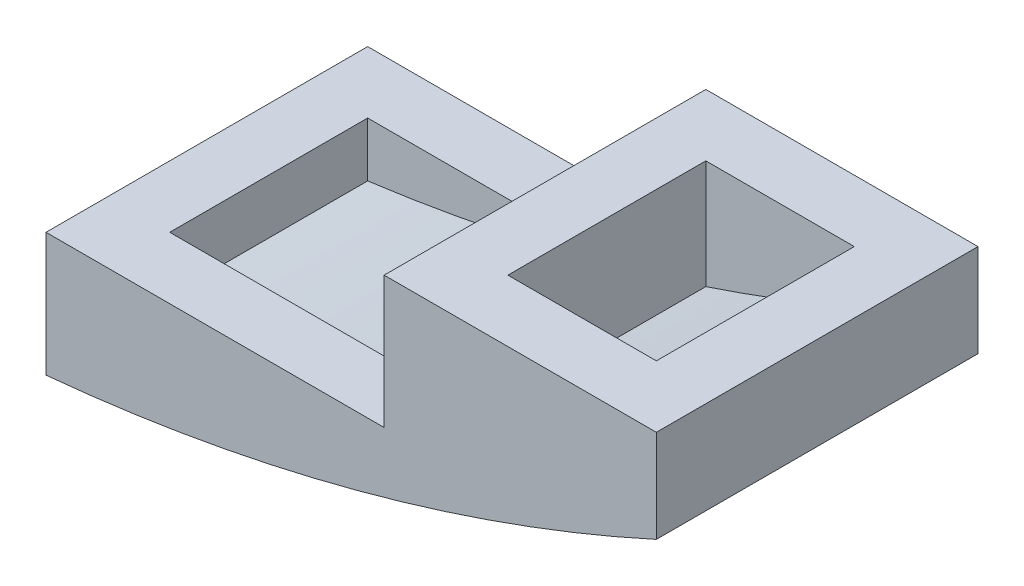
ISO-10303-21;
HEADER;
FILE_DESCRIPTION(('STEP AP214'),'2;1');
FILE_NAME('part.step','',(''),(''),'','','');
FILE_SCHEMA(('AUTOMOTIVE_DESIGN { 1 0 10303 214 1 1 1 1 }'));
ENDSEC;
DATA;
#1=APPLICATION_CONTEXT('core data for automotive mechanical design processes');
#2=APPLICATION_PROTOCOL_DEFINITION('international standard','automotive_design',2000,#1);
#3=PRODUCT_CONTEXT('',#1,'mechanical');
#4=PRODUCT('Part','Part','',(#3));
#5=PRODUCT_RELATED_PRODUCT_CATEGORY('part','',(#4));
#6=PRODUCT_DEFINITION_FORMATION('','',#4);
#7=PRODUCT_DEFINITION_CONTEXT('part definition',#1,'design');
#8=PRODUCT_DEFINITION('design','',#6,#7);
#9=PRODUCT_DEFINITION_SHAPE('','',#8);
#10=(LENGTH_UNIT() NAMED_UNIT(*) SI_UNIT(.MILLI.,.METRE.));
#11=(NAMED_UNIT(*) PLANE_ANGLE_UNIT() SI_UNIT($,.RADIAN.));
#12=(NAMED_UNIT(*) SI_UNIT($,.STERADIAN.) SOLID_ANGLE_UNIT());
#13=UNCERTAINTY_MEASURE_WITH_UNIT(LENGTH_MEASURE(1.E-05),#10,'distance_accuracy_value','');
#14=(GEOMETRIC_REPRESENTATION_CONTEXT(3) GLOBAL_UNCERTAINTY_ASSIGNED_CONTEXT((#13)) GLOBAL_UNIT_ASSIGNED_CONTEXT((#10,
#11,#12)) REPRESENTATION_CONTEXT('',''));
#15=CARTESIAN_POINT('',(0.,0.,0.));
#16=DIRECTION('',(0.,0.,1.));
#17=DIRECTION('',(1.,0.,0.));
#18=AXIS2_PLACEMENT_3D('',#15,#16,#17);
#19=CARTESIAN_POINT('',(12.5302756443327,-42.9264125407907,-7.8));
#20=DIRECTION('',(0.,1.,0.));
#21=DIRECTION('',(0.,0.,1.));
#22=AXIS2_PLACEMENT_3D('',#19,#20,#21);
#23=PLANE('',#22);
#24=DIRECTION('',(-1.,0.,0.));
#25=VECTOR('',#24,1.);
#26=CARTESIAN_POINT('',(12.5302756443327,-42.9264125407907,0.));
#27=LINE('',#26,#25);
#28=CARTESIAN_POINT('',(12.5302756443327,-42.9264125407907,0.));
#29=VERTEX_POINT('',#28);
#30=CARTESIAN_POINT('',(4.33027564433265,-42.9264125407907,0.));
#31=VERTEX_POINT('',#30);
#32=EDGE_CURVE('E217',#29,#31,#27,.T.);
#33=ORIENTED_EDGE('',*,*,#32,.F.);
#34=DIRECTION('',(0.,0.,1.));
#35=VECTOR('',#34,1.);
#36=CARTESIAN_POINT('',(12.5302756443327,-42.9264125407907,-7.8));
#37=LINE('',#36,#35);
#38=CARTESIAN_POINT('',(12.5302756443327,-42.9264125407907,-7.8));
#39=VERTEX_POINT('',#38);
#40=EDGE_CURVE('E223',#39,#29,#37,.T.);
#41=ORIENTED_EDGE('',*,*,#40,.F.);
#42=DIRECTION('',(-1.,0.,0.));
#43=VECTOR('',#42,1.);
#44=CARTESIAN_POINT('',(12.5302756443327,-42.9264125407907,-7.8));
#45=LINE('',#44,#43);
#46=CARTESIAN_POINT('',(4.33027564433265,-42.9264125407907,-7.8));
#47=VERTEX_POINT('',#46);
#48=EDGE_CURVE('E200',#39,#47,#45,.T.);
#49=ORIENTED_EDGE('',*,*,#48,.T.);
#50=DIRECTION('',(0.,0.,1.));
#51=VECTOR('',#50,1.);
#52=CARTESIAN_POINT('',(4.33027564433265,-42.9264125407907,-7.8));
#53=LINE('',#52,#51);
#54=EDGE_CURVE('E43',#47,#31,#53,.T.);
#55=ORIENTED_EDGE('',*,*,#54,.T.);
#56=EDGE_LOOP('',(#33,#41,#49,#55));
#57=FACE_BOUND('',#56,.T.);
#58=DIRECTION('',(0.,0.,1.));
#59=VECTOR('',#58,1.);
#60=CARTESIAN_POINT('',(12.2134943880268,-42.9264125407907,-7.8));
#61=LINE('',#60,#59);
#62=CARTESIAN_POINT('',(12.2134943880268,-42.9264125407907,-1.5));
#63=VERTEX_POINT('',#62);
#64=CARTESIAN_POINT('',(12.2134943880268,-42.9264125407907,-6.3));
#65=VERTEX_POINT('',#64);
#66=EDGE_CURVE('E138',#63,#65,#61,.F.);
#67=ORIENTED_EDGE('',*,*,#66,.F.);
#68=DIRECTION('',(-1.,0.,0.));
#69=VECTOR('',#68,1.);
#70=CARTESIAN_POINT('',(0.,-42.9264125407907,-1.5));
#71=LINE('',#70,#69);
#72=CARTESIAN_POINT('',(5.83027564433265,-42.9264125407907,-1.5));
#73=VERTEX_POINT('',#72);
#74=EDGE_CURVE('E168',#63,#73,#71,.T.);
#75=ORIENTED_EDGE('',*,*,#74,.T.);
#76=DIRECTION('',(0.,0.,1.));
#77=VECTOR('',#76,1.);
#78=CARTESIAN_POINT('',(5.83027564433265,-42.9264125407907,-7.8));
#79=LINE('',#78,#77);
#80=CARTESIAN_POINT('',(5.83027564433265,-42.9264125407907,-6.3));
#81=VERTEX_POINT('',#80);
#82=EDGE_CURVE('E148',#81,#73,#79,.T.);
#83=ORIENTED_EDGE('',*,*,#82,.F.);
#84=DIRECTION('',(-1.,0.,0.));
#85=VECTOR('',#84,1.);
#86=CARTESIAN_POINT('',(0.,-42.9264125407907,-6.3));
#87=LINE('',#86,#85);
#88=EDGE_CURVE('E151',#65,#81,#87,.T.);
#89=ORIENTED_EDGE('',*,*,#88,.F.);
#90=EDGE_LOOP('',(#67,#75,#83,#89));
#91=FACE_BOUND('',#90,.T.);
#92=ADVANCED_FACE('F34',(#57,#91),#23,.T.);
#93=CARTESIAN_POINT('',(19.1302756443327,-39.7264125407907,-7.8));
#94=DIRECTION('',(0.,1.,0.));
#95=DIRECTION('',(0.,0.,1.));
#96=AXIS2_PLACEMENT_3D('',#93,#94,#95);
#97=PLANE('',#96);
#98=DIRECTION('',(-1.,0.,0.));
#99=VECTOR('',#98,1.);
#100=CARTESIAN_POINT('',(19.1302756443327,-39.7264125407907,0.));
#101=LINE('',#100,#99);
#102=CARTESIAN_POINT('',(19.1302756443327,-39.7264125407907,0.));
#103=VERTEX_POINT('',#102);
#104=CARTESIAN_POINT('',(12.5302756443327,-39.7264125407907,0.));
#105=VERTEX_POINT('',#104);
#106=EDGE_CURVE('E211',#103,#105,#101,.T.);
#107=ORIENTED_EDGE('',*,*,#106,.F.);
#108=DIRECTION('',(0.,0.,1.));
#109=VECTOR('',#108,1.);
#110=CARTESIAN_POINT('',(19.1302756443327,-39.7264125407907,-7.8));
#111=LINE('',#110,#109);
#112=CARTESIAN_POINT('',(19.1302756443327,-39.7264125407907,-7.8));
#113=VERTEX_POINT('',#112);
#114=EDGE_CURVE('E226',#113,#103,#111,.T.);
#115=ORIENTED_EDGE('',*,*,#114,.F.);
#116=DIRECTION('',(-1.,0.,0.));
#117=VECTOR('',#116,1.);
#118=CARTESIAN_POINT('',(19.1302756443327,-39.7264125407907,-7.8));
#119=LINE('',#118,#117);
#120=CARTESIAN_POINT('',(12.5302756443327,-39.7264125407907,-7.8));
#121=VERTEX_POINT('',#120);
#122=EDGE_CURVE('E194',#113,#121,#119,.T.);
#123=ORIENTED_EDGE('',*,*,#122,.T.);
#124=DIRECTION('',(0.,0.,1.));
#125=VECTOR('',#124,1.);
#126=CARTESIAN_POINT('',(12.5302756443327,-39.7264125407907,-7.8));
#127=LINE('',#126,#125);
#128=EDGE_CURVE('E225',#121,#105,#127,.T.);
#129=ORIENTED_EDGE('',*,*,#128,.T.);
#130=EDGE_LOOP('',(#107,#115,#123,#129));
#131=FACE_BOUND('',#130,.T.);
#132=DIRECTION('',(0.,0.,1.));
#133=VECTOR('',#132,1.);
#134=CARTESIAN_POINT('',(17.6302756443327,-39.7264125407907,-7.8));
#135=LINE('',#134,#133);
#136=CARTESIAN_POINT('',(17.6302756443327,-39.7264125407907,-6.3));
#137=VERTEX_POINT('',#136);
#138=CARTESIAN_POINT('',(17.6302756443327,-39.7264125407907,-1.5));
#139=VERTEX_POINT('',#138);
#140=EDGE_CURVE('E156',#137,#139,#135,.T.);
#141=ORIENTED_EDGE('',*,*,#140,.T.);
#142=DIRECTION('',(-1.,0.,0.));
#143=VECTOR('',#142,1.);
#144=CARTESIAN_POINT('',(0.,-39.7264125407907,-1.5));
#145=LINE('',#144,#143);
#146=CARTESIAN_POINT('',(14.0302756443326,-39.7264125407907,-1.5));
#147=VERTEX_POINT('',#146);
#148=EDGE_CURVE('E169',#139,#147,#145,.T.);
#149=ORIENTED_EDGE('',*,*,#148,.T.);
#150=DIRECTION('',(0.,0.,1.));
#151=VECTOR('',#150,1.);
#152=CARTESIAN_POINT('',(14.0302756443326,-39.7264125407907,-7.8));
#153=LINE('',#152,#151);
#154=CARTESIAN_POINT('',(14.0302756443326,-39.7264125407907,-6.3));
#155=VERTEX_POINT('',#154);
#156=EDGE_CURVE('E175',#155,#147,#153,.T.);
#157=ORIENTED_EDGE('',*,*,#156,.F.);
#158=DIRECTION('',(-1.,0.,0.));
#159=VECTOR('',#158,1.);
#160=CARTESIAN_POINT('',(0.,-39.7264125407907,-6.3));
#161=LINE('',#160,#159);
#162=EDGE_CURVE('E59',#137,#155,#161,.T.);
#163=ORIENTED_EDGE('',*,*,#162,.F.);
#164=EDGE_LOOP('',(#141,#149,#157,#163));
#165=FACE_BOUND('',#164,.T.);
#166=ADVANCED_FACE('F248',(#131,#165),#97,.T.);
#167=CARTESIAN_POINT('',(0.,0.,-7.8));
#168=DIRECTION('',(0.,0.,1.));
#169=DIRECTION('',(1.,0.,0.));
#170=AXIS2_PLACEMENT_3D('',#167,#168,#169);
#171=CYLINDRICAL_SURFACE('',#170,46.1301057447607);
#172=CARTESIAN_POINT('',(0.,0.,0.));
#173=DIRECTION('',(0.,0.,1.));
#174=DIRECTION('',(1.,0.,0.));
#175=AXIS2_PLACEMENT_3D('',#172,#173,#174);
#176=CIRCLE('',#175,46.1301057447607);
#177=CARTESIAN_POINT('',(4.33027564433265,-45.9264125407907,0.));
#178=VERTEX_POINT('',#177);
#179=CARTESIAN_POINT('',(19.1302756443327,-41.9764125407907,0.));
#180=VERTEX_POINT('',#179);
#181=EDGE_CURVE('E186',#178,#180,#176,.T.);
#182=ORIENTED_EDGE('',*,*,#181,.F.);
#183=DIRECTION('',(0.,0.,1.));
#184=VECTOR('',#183,1.);
#185=CARTESIAN_POINT('',(4.33027564433265,-45.9264125407907,-7.8));
#186=LINE('',#185,#184);
#187=CARTESIAN_POINT('',(4.33027564433265,-45.9264125407907,-7.8));
#188=VERTEX_POINT('',#187);
#189=EDGE_CURVE('E11',#188,#178,#186,.T.);
#190=ORIENTED_EDGE('',*,*,#189,.F.);
#191=CARTESIAN_POINT('',(0.,0.,-7.8));
#192=DIRECTION('',(0.,0.,1.));
#193=DIRECTION('',(1.,0.,0.));
#194=AXIS2_PLACEMENT_3D('',#191,#192,#193);
#195=CIRCLE('',#194,46.1301057447607);
#196=CARTESIAN_POINT('',(19.1302756443327,-41.9764125407907,-7.8));
#197=VERTEX_POINT('',#196);
#198=EDGE_CURVE('E187',#188,#197,#195,.T.);
#199=ORIENTED_EDGE('',*,*,#198,.T.);
#200=DIRECTION('',(0.,0.,1.));
#201=VECTOR('',#200,1.);
#202=CARTESIAN_POINT('',(19.1302756443327,-41.9764125407907,-7.8));
#203=LINE('',#202,#201);
#204=EDGE_CURVE('E38',#197,#180,#203,.T.);
#205=ORIENTED_EDGE('',*,*,#204,.T.);
#206=EDGE_LOOP('',(#182,#190,#199,#205));
#207=FACE_BOUND('',#206,.T.);
#208=ADVANCED_FACE('F36',(#207),#171,.T.);
#209=CARTESIAN_POINT('',(4.33027564433265,-42.9264125407907,-7.8));
#210=DIRECTION('',(-1.,0.,0.));
#211=DIRECTION('',(0.,-1.,0.));
#212=AXIS2_PLACEMENT_3D('',#209,#210,#211);
#213=PLANE('',#212);
#214=DIRECTION('',(0.,-1.,0.));
#215=VECTOR('',#214,1.);
#216=CARTESIAN_POINT('',(4.33027564433265,-42.9264125407907,0.));
#217=LINE('',#216,#215);
#218=EDGE_CURVE('E191',#31,#178,#217,.T.);
#219=ORIENTED_EDGE('',*,*,#218,.F.);
#220=ORIENTED_EDGE('',*,*,#54,.F.);
#221=DIRECTION('',(0.,-1.,0.));
#222=VECTOR('',#221,1.);
#223=CARTESIAN_POINT('',(4.33027564433265,-42.9264125407907,-7.8));
#224=LINE('',#223,#222);
#225=EDGE_CURVE('E203',#47,#188,#224,.T.);
#226=ORIENTED_EDGE('',*,*,#225,.T.);
#227=ORIENTED_EDGE('',*,*,#189,.T.);
#228=EDGE_LOOP('',(#219,#220,#226,#227));
#229=FACE_BOUND('',#228,.T.);
#230=ADVANCED_FACE('F240',(#229),#213,.T.);
#231=CARTESIAN_POINT('',(12.5302756443327,-39.7264125407907,-7.8));
#232=DIRECTION('',(-1.,0.,0.));
#233=DIRECTION('',(0.,0.,1.));
#234=AXIS2_PLACEMENT_3D('',#231,#232,#233);
#235=PLANE('',#234);
#236=DIRECTION('',(0.,-1.,0.));
#237=VECTOR('',#236,1.);
#238=CARTESIAN_POINT('',(12.5302756443327,-39.7264125407907,0.));
#239=LINE('',#238,#237);
#240=EDGE_CURVE('E214',#105,#29,#239,.T.);
#241=ORIENTED_EDGE('',*,*,#240,.F.);
#242=ORIENTED_EDGE('',*,*,#128,.F.);
#243=DIRECTION('',(0.,-1.,0.));
#244=VECTOR('',#243,1.);
#245=CARTESIAN_POINT('',(12.5302756443327,-39.7264125407907,-7.8));
#246=LINE('',#245,#244);
#247=EDGE_CURVE('E197',#121,#39,#246,.T.);
#248=ORIENTED_EDGE('',*,*,#247,.T.);
#249=ORIENTED_EDGE('',*,*,#40,.T.);
#250=EDGE_LOOP('',(#241,#242,#248,#249));
#251=FACE_BOUND('',#250,.T.);
#252=ADVANCED_FACE('F252',(#251),#235,.T.);
#253=CARTESIAN_POINT('',(19.1302756443327,-41.9764125407907,-7.8));
#254=DIRECTION('',(1.,0.,0.));
#255=DIRECTION('',(0.,0.,-1.));
#256=AXIS2_PLACEMENT_3D('',#253,#254,#255);
#257=PLANE('',#256);
#258=DIRECTION('',(0.,1.,0.));
#259=VECTOR('',#258,1.);
#260=CARTESIAN_POINT('',(19.1302756443327,-41.9764125407907,0.));
#261=LINE('',#260,#259);
#262=EDGE_CURVE('E208',#180,#103,#261,.T.);
#263=ORIENTED_EDGE('',*,*,#262,.F.);
#264=ORIENTED_EDGE('',*,*,#204,.F.);
#265=DIRECTION('',(0.,1.,0.));
#266=VECTOR('',#265,1.);
#267=CARTESIAN_POINT('',(19.1302756443327,-41.9764125407907,-7.8));
#268=LINE('',#267,#266);
#269=EDGE_CURVE('E190',#197,#113,#268,.T.);
#270=ORIENTED_EDGE('',*,*,#269,.T.);
#271=ORIENTED_EDGE('',*,*,#114,.T.);
#272=EDGE_LOOP('',(#263,#264,#270,#271));
#273=FACE_BOUND('',#272,.T.);
#274=ADVANCED_FACE('F234',(#273),#257,.T.);
#275=CARTESIAN_POINT('',(0.,0.,-7.8));
#276=DIRECTION('',(0.,0.,1.));
#277=DIRECTION('',(1.,0.,0.));
#278=AXIS2_PLACEMENT_3D('',#275,#276,#277);
#279=PLANE('',#278);
#280=ORIENTED_EDGE('',*,*,#198,.F.);
#281=ORIENTED_EDGE('',*,*,#225,.F.);
#282=ORIENTED_EDGE('',*,*,#48,.F.);
#283=ORIENTED_EDGE('',*,*,#247,.F.);
#284=ORIENTED_EDGE('',*,*,#122,.F.);
#285=ORIENTED_EDGE('',*,*,#269,.F.);
#286=EDGE_LOOP('',(#280,#281,#282,#283,#284,#285));
#287=FACE_BOUND('',#286,.T.);
#288=ADVANCED_FACE('F243',(#287),#279,.F.);
#289=CARTESIAN_POINT('',(0.,0.,0.));
#290=DIRECTION('',(0.,0.,1.));
#291=DIRECTION('',(1.,0.,0.));
#292=AXIS2_PLACEMENT_3D('',#289,#290,#291);
#293=PLANE('',#292);
#294=ORIENTED_EDGE('',*,*,#181,.T.);
#295=ORIENTED_EDGE('',*,*,#262,.T.);
#296=ORIENTED_EDGE('',*,*,#106,.T.);
#297=ORIENTED_EDGE('',*,*,#240,.T.);
#298=ORIENTED_EDGE('',*,*,#32,.T.);
#299=ORIENTED_EDGE('',*,*,#218,.T.);
#300=EDGE_LOOP('',(#294,#295,#296,#297,#298,#299));
#301=FACE_BOUND('',#300,.T.);
#302=ADVANCED_FACE('F236',(#301),#293,.T.);
#303=CARTESIAN_POINT('',(0.,0.,-1.5));
#304=DIRECTION('',(0.,0.,1.));
#305=DIRECTION('',(1.,0.,0.));
#306=AXIS2_PLACEMENT_3D('',#303,#304,#305);
#307=PLANE('',#306);
#308=DIRECTION('',(0.,-1.,0.));
#309=VECTOR('',#308,1.);
#310=CARTESIAN_POINT('',(14.0302756443326,0.,-1.5));
#311=LINE('',#310,#309);
#312=CARTESIAN_POINT('',(14.0302756443326,-42.3674132339061,-1.5));
#313=VERTEX_POINT('',#312);
#314=EDGE_CURVE('E165',#147,#313,#311,.T.);
#315=ORIENTED_EDGE('',*,*,#314,.F.);
#316=ORIENTED_EDGE('',*,*,#148,.F.);
#317=DIRECTION('',(0.,1.,0.));
#318=VECTOR('',#317,1.);
#319=CARTESIAN_POINT('',(17.6302756443327,0.,-1.5));
#320=LINE('',#319,#318);
#321=CARTESIAN_POINT('',(17.6302756443327,-41.0002404809212,-1.5));
#322=VERTEX_POINT('',#321);
#323=EDGE_CURVE('E170',#322,#139,#320,.T.);
#324=ORIENTED_EDGE('',*,*,#323,.F.);
#325=CARTESIAN_POINT('',(0.,0.,-1.5));
#326=DIRECTION('',(0.,0.,1.));
#327=DIRECTION('',(1.,0.,0.));
#328=AXIS2_PLACEMENT_3D('',#325,#326,#327);
#329=CIRCLE('',#328,44.6301057447607);
#330=EDGE_CURVE('E259',#313,#322,#329,.T.);
#331=ORIENTED_EDGE('',*,*,#330,.F.);
#332=EDGE_LOOP('',(#315,#316,#324,#331));
#333=FACE_BOUND('',#332,.T.);
#334=ADVANCED_FACE('F276',(#333),#307,.F.);
#335=CARTESIAN_POINT('',(0.,0.,-7.8));
#336=DIRECTION('',(0.,0.,1.));
#337=DIRECTION('',(1.,0.,0.));
#338=AXIS2_PLACEMENT_3D('',#335,#336,#337);
#339=CYLINDRICAL_SURFACE('',#338,44.6301057447607);
#340=ORIENTED_EDGE('',*,*,#330,.T.);
#341=DIRECTION('',(0.,0.,1.));
#342=VECTOR('',#341,1.);
#343=CARTESIAN_POINT('',(17.6302756443327,-41.0002404809212,-6.3));
#344=LINE('',#343,#342);
#345=CARTESIAN_POINT('',(17.6302756443327,-41.0002404809212,-6.3));
#346=VERTEX_POINT('',#345);
#347=EDGE_CURVE('E153',#346,#322,#344,.T.);
#348=ORIENTED_EDGE('',*,*,#347,.F.);
#349=CARTESIAN_POINT('',(0.,0.,-6.3));
#350=DIRECTION('',(0.,0.,1.));
#351=DIRECTION('',(1.,0.,0.));
#352=AXIS2_PLACEMENT_3D('',#349,#350,#351);
#353=CIRCLE('',#352,44.6301057447607);
#354=CARTESIAN_POINT('',(14.0302756443326,-42.3674132339061,-6.3));
#355=VERTEX_POINT('',#354);
#356=EDGE_CURVE('E141',#355,#346,#353,.T.);
#357=ORIENTED_EDGE('',*,*,#356,.F.);
#358=DIRECTION('',(0.,0.,1.));
#359=VECTOR('',#358,1.);
#360=CARTESIAN_POINT('',(14.0302756443326,-42.3674132339061,-7.8));
#361=LINE('',#360,#359);
#362=EDGE_CURVE('E147',#313,#355,#361,.F.);
#363=ORIENTED_EDGE('',*,*,#362,.F.);
#364=EDGE_LOOP('',(#340,#348,#357,#363));
#365=FACE_BOUND('',#364,.T.);
#366=ADVANCED_FACE('F266',(#365),#339,.F.);
#367=CARTESIAN_POINT('',(14.0302756443326,-39.7264125407907,-7.8));
#368=DIRECTION('',(-1.,0.,0.));
#369=DIRECTION('',(0.,0.,1.));
#370=AXIS2_PLACEMENT_3D('',#367,#368,#369);
#371=PLANE('',#370);
#372=ORIENTED_EDGE('',*,*,#362,.T.);
#373=DIRECTION('',(0.,-1.,0.));
#374=VECTOR('',#373,1.);
#375=CARTESIAN_POINT('',(14.0302756443326,0.,-6.3));
#376=LINE('',#375,#374);
#377=EDGE_CURVE('E158',#155,#355,#376,.T.);
#378=ORIENTED_EDGE('',*,*,#377,.F.);
#379=ORIENTED_EDGE('',*,*,#156,.T.);
#380=ORIENTED_EDGE('',*,*,#314,.T.);
#381=EDGE_LOOP('',(#372,#378,#379,#380));
#382=FACE_BOUND('',#381,.T.);
#383=ADVANCED_FACE('F274',(#382),#371,.F.);
#384=CARTESIAN_POINT('',(17.6302756443327,-41.9764125407907,-7.8));
#385=DIRECTION('',(1.,0.,0.));
#386=DIRECTION('',(0.,0.,-1.));
#387=AXIS2_PLACEMENT_3D('',#384,#385,#386);
#388=PLANE('',#387);
#389=ORIENTED_EDGE('',*,*,#323,.T.);
#390=ORIENTED_EDGE('',*,*,#140,.F.);
#391=DIRECTION('',(0.,1.,0.));
#392=VECTOR('',#391,1.);
#393=CARTESIAN_POINT('',(17.6302756443327,0.,-6.3));
#394=LINE('',#393,#392);
#395=EDGE_CURVE('E163',#346,#137,#394,.T.);
#396=ORIENTED_EDGE('',*,*,#395,.F.);
#397=ORIENTED_EDGE('',*,*,#347,.T.);
#398=EDGE_LOOP('',(#389,#390,#396,#397));
#399=FACE_BOUND('',#398,.T.);
#400=ADVANCED_FACE('F270',(#399),#388,.F.);
#401=CARTESIAN_POINT('',(0.,0.,-6.3));
#402=DIRECTION('',(0.,0.,1.));
#403=DIRECTION('',(1.,0.,0.));
#404=AXIS2_PLACEMENT_3D('',#401,#402,#403);
#405=PLANE('',#404);
#406=ORIENTED_EDGE('',*,*,#356,.T.);
#407=ORIENTED_EDGE('',*,*,#395,.T.);
#408=ORIENTED_EDGE('',*,*,#162,.T.);
#409=ORIENTED_EDGE('',*,*,#377,.T.);
#410=EDGE_LOOP('',(#406,#407,#408,#409));
#411=FACE_BOUND('',#410,.T.);
#412=ADVANCED_FACE('F263',(#411),#405,.T.);
#413=CARTESIAN_POINT('',(5.83027564433265,-44.2476465441906,-1.5));
#414=VERTEX_POINT('',#413);
#415=EDGE_CURVE('E173',#414,#63,#329,.T.);
#416=ORIENTED_EDGE('',*,*,#415,.F.);
#417=DIRECTION('',(0.,-1.,0.));
#418=VECTOR('',#417,1.);
#419=CARTESIAN_POINT('',(5.83027564433266,0.,-1.5));
#420=LINE('',#419,#418);
#421=EDGE_CURVE('E142',#73,#414,#420,.T.);
#422=ORIENTED_EDGE('',*,*,#421,.F.);
#423=ORIENTED_EDGE('',*,*,#74,.F.);
#424=EDGE_LOOP('',(#416,#422,#423));
#425=FACE_BOUND('',#424,.T.);
#426=ADVANCED_FACE('F258',(#425),#307,.F.);
#427=CARTESIAN_POINT('',(5.83027564433265,-42.9264125407907,-7.8));
#428=DIRECTION('',(-1.,0.,0.));
#429=DIRECTION('',(0.,-1.,0.));
#430=AXIS2_PLACEMENT_3D('',#427,#428,#429);
#431=PLANE('',#430);
#432=ORIENTED_EDGE('',*,*,#421,.T.);
#433=DIRECTION('',(0.,0.,1.));
#434=VECTOR('',#433,1.);
#435=CARTESIAN_POINT('',(5.83027564433265,-44.2476465441906,-6.3));
#436=LINE('',#435,#434);
#437=CARTESIAN_POINT('',(5.83027564433265,-44.2476465441906,-6.3));
#438=VERTEX_POINT('',#437);
#439=EDGE_CURVE('E135',#438,#414,#436,.T.);
#440=ORIENTED_EDGE('',*,*,#439,.F.);
#441=DIRECTION('',(0.,-1.,0.));
#442=VECTOR('',#441,1.);
#443=CARTESIAN_POINT('',(5.83027564433266,0.,-6.3));
#444=LINE('',#443,#442);
#445=EDGE_CURVE('E51',#81,#438,#444,.T.);
#446=ORIENTED_EDGE('',*,*,#445,.F.);
#447=ORIENTED_EDGE('',*,*,#82,.T.);
#448=EDGE_LOOP('',(#432,#440,#446,#447));
#449=FACE_BOUND('',#448,.T.);
#450=ADVANCED_FACE('F145',(#449),#431,.F.);
#451=ORIENTED_EDGE('',*,*,#88,.T.);
#452=ORIENTED_EDGE('',*,*,#445,.T.);
#453=EDGE_CURVE('E132',#438,#65,#353,.T.);
#454=ORIENTED_EDGE('',*,*,#453,.T.);
#455=EDGE_LOOP('',(#451,#452,#454));
#456=FACE_BOUND('',#455,.T.);
#457=ADVANCED_FACE('F150',(#456),#405,.T.);
#458=ORIENTED_EDGE('',*,*,#66,.T.);
#459=ORIENTED_EDGE('',*,*,#453,.F.);
#460=ORIENTED_EDGE('',*,*,#439,.T.);
#461=ORIENTED_EDGE('',*,*,#415,.T.);
#462=EDGE_LOOP('',(#458,#459,#460,#461));
#463=FACE_BOUND('',#462,.T.);
#464=ADVANCED_FACE('F133',(#463),#339,.F.);
#465=CLOSED_SHELL('',(#92,#166,#208,#230,#252,#274,#288,#302,#334,#366,#383,#400,#412,#426,#450,
#457,#464));
#466=MANIFOLD_SOLID_BREP('B2',#465);
#467=ADVANCED_BREP_SHAPE_REPRESENTATION('',(#18,#466),#14);
#468=SHAPE_DEFINITION_REPRESENTATION(#9,#467);
ENDSEC;
END-ISO-10303-21;
